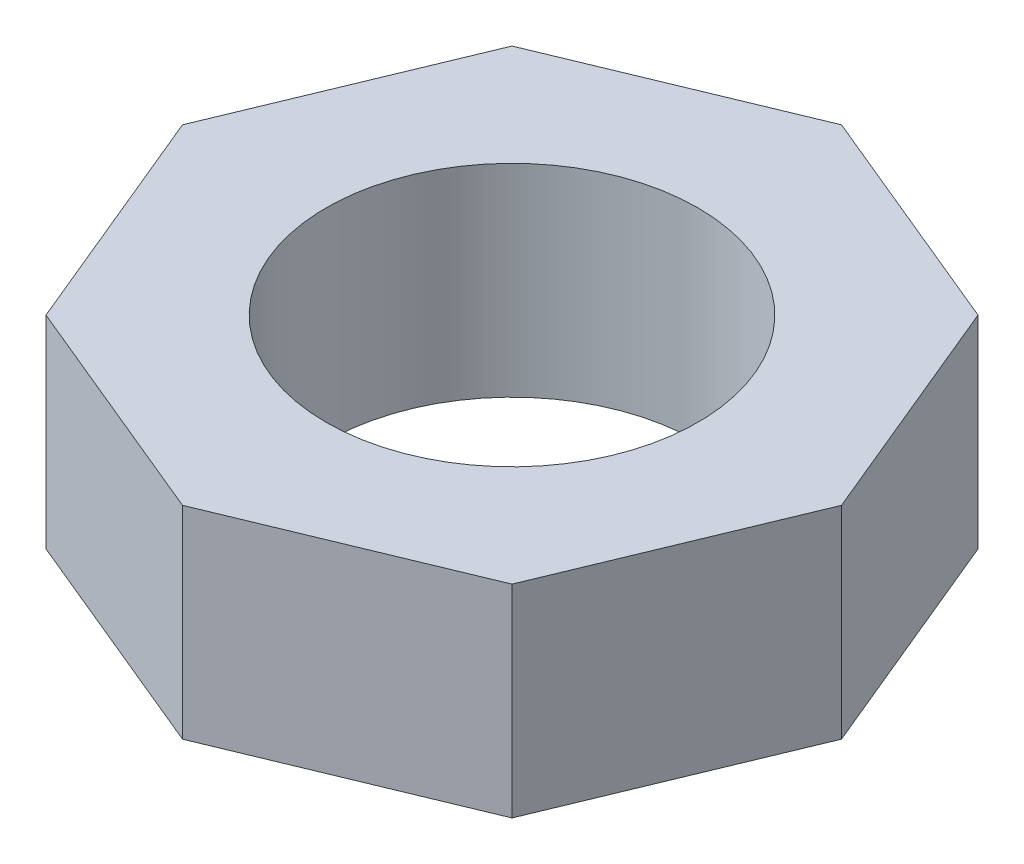
ISO-10303-21;
HEADER;
FILE_DESCRIPTION(('STEP AP214'),'2;1');
FILE_NAME('part.step','',(''),(''),'','','');
FILE_SCHEMA(('AUTOMOTIVE_DESIGN { 1 0 10303 214 1 1 1 1 }'));
ENDSEC;
DATA;
#1=APPLICATION_CONTEXT('core data for automotive mechanical design processes');
#2=APPLICATION_PROTOCOL_DEFINITION('international standard','automotive_design',2000,#1);
#3=PRODUCT_CONTEXT('',#1,'mechanical');
#4=PRODUCT('Part','Part','',(#3));
#5=PRODUCT_RELATED_PRODUCT_CATEGORY('part','',(#4));
#6=PRODUCT_DEFINITION_FORMATION('','',#4);
#7=PRODUCT_DEFINITION_CONTEXT('part definition',#1,'design');
#8=PRODUCT_DEFINITION('design','',#6,#7);
#9=PRODUCT_DEFINITION_SHAPE('','',#8);
#10=(LENGTH_UNIT() NAMED_UNIT(*) SI_UNIT(.MILLI.,.METRE.));
#11=(NAMED_UNIT(*) PLANE_ANGLE_UNIT() SI_UNIT($,.RADIAN.));
#12=(NAMED_UNIT(*) SI_UNIT($,.STERADIAN.) SOLID_ANGLE_UNIT());
#13=UNCERTAINTY_MEASURE_WITH_UNIT(LENGTH_MEASURE(1.E-05),#10,'distance_accuracy_value','');
#14=(GEOMETRIC_REPRESENTATION_CONTEXT(3) GLOBAL_UNCERTAINTY_ASSIGNED_CONTEXT((#13)) GLOBAL_UNIT_ASSIGNED_CONTEXT((#10,
#11,#12)) REPRESENTATION_CONTEXT('',''));
#15=CARTESIAN_POINT('',(0.,0.,0.));
#16=DIRECTION('',(0.,0.,1.));
#17=DIRECTION('',(1.,0.,0.));
#18=AXIS2_PLACEMENT_3D('',#15,#16,#17);
#19=CARTESIAN_POINT('',(0.,1.55,0.));
#20=DIRECTION('',(0.,1.,0.));
#21=DIRECTION('',(0.,0.,1.));
#22=AXIS2_PLACEMENT_3D('',#19,#20,#21);
#23=PLANE('',#22);
#24=DIRECTION('',(0.382683432365078,0.,-0.923879532511292));
#25=VECTOR('',#24,1.);
#26=CARTESIAN_POINT('',(1.78330479482134,1.55,1.7833047948213));
#27=LINE('',#26,#25);
#28=CARTESIAN_POINT('',(1.78330479482134,1.55,1.7833047948213));
#29=VERTEX_POINT('',#28);
#30=CARTESIAN_POINT('',(2.52197382668128,1.55,0.));
#31=VERTEX_POINT('',#30);
#32=EDGE_CURVE('E144',#29,#31,#27,.T.);
#33=ORIENTED_EDGE('',*,*,#32,.T.);
#34=DIRECTION('',(-0.382683432365102,0.,-0.923879532511282));
#35=VECTOR('',#34,1.);
#36=CARTESIAN_POINT('',(2.52197382668128,1.55,0.));
#37=LINE('',#36,#35);
#38=CARTESIAN_POINT('',(1.78330479482129,1.55,-1.78330479482134));
#39=VERTEX_POINT('',#38);
#40=EDGE_CURVE('E92',#31,#39,#37,.T.);
#41=ORIENTED_EDGE('',*,*,#40,.T.);
#42=DIRECTION('',(-0.923879532511292,0.,-0.382683432365078));
#43=VECTOR('',#42,1.);
#44=CARTESIAN_POINT('',(1.78330479482129,1.55,-1.78330479482134));
#45=LINE('',#44,#43);
#46=CARTESIAN_POINT('',(0.,1.55,-2.52197382668128));
#47=VERTEX_POINT('',#46);
#48=EDGE_CURVE('E159',#39,#47,#45,.T.);
#49=ORIENTED_EDGE('',*,*,#48,.T.);
#50=DIRECTION('',(-0.923879532511282,0.,0.382683432365102));
#51=VECTOR('',#50,1.);
#52=CARTESIAN_POINT('',(0.,1.55,-2.52197382668128));
#53=LINE('',#52,#51);
#54=CARTESIAN_POINT('',(-1.78330479482134,1.55,-1.7833047948213));
#55=VERTEX_POINT('',#54);
#56=EDGE_CURVE('E172',#47,#55,#53,.T.);
#57=ORIENTED_EDGE('',*,*,#56,.T.);
#58=DIRECTION('',(-0.382683432365078,0.,0.923879532511292));
#59=VECTOR('',#58,1.);
#60=CARTESIAN_POINT('',(-1.78330479482134,1.55,-1.7833047948213));
#61=LINE('',#60,#59);
#62=CARTESIAN_POINT('',(-2.52197382668128,1.55,0.));
#63=VERTEX_POINT('',#62);
#64=EDGE_CURVE('E111',#55,#63,#61,.T.);
#65=ORIENTED_EDGE('',*,*,#64,.T.);
#66=DIRECTION('',(0.382683432365101,0.,0.923879532511282));
#67=VECTOR('',#66,1.);
#68=CARTESIAN_POINT('',(-2.52197382668128,1.55,0.));
#69=LINE('',#68,#67);
#70=CARTESIAN_POINT('',(-1.7833047948213,1.55,1.78330479482134));
#71=VERTEX_POINT('',#70);
#72=EDGE_CURVE('E105',#63,#71,#69,.T.);
#73=ORIENTED_EDGE('',*,*,#72,.T.);
#74=DIRECTION('',(0.923879532511292,0.,0.382683432365078));
#75=VECTOR('',#74,1.);
#76=CARTESIAN_POINT('',(-1.7833047948213,1.55,1.78330479482134));
#77=LINE('',#76,#75);
#78=CARTESIAN_POINT('',(0.,1.55,2.52197382668128));
#79=VERTEX_POINT('',#78);
#80=EDGE_CURVE('E109',#71,#79,#77,.T.);
#81=ORIENTED_EDGE('',*,*,#80,.T.);
#82=DIRECTION('',(0.923879532511282,0.,-0.382683432365102));
#83=VECTOR('',#82,1.);
#84=CARTESIAN_POINT('',(0.,1.55,2.52197382668128));
#85=LINE('',#84,#83);
#86=EDGE_CURVE('E49',#79,#29,#85,.T.);
#87=ORIENTED_EDGE('',*,*,#86,.T.);
#88=EDGE_LOOP('',(#33,#41,#49,#57,#65,#73,#81,#87));
#89=FACE_BOUND('',#88,.T.);
#90=CARTESIAN_POINT('',(0.,1.55,0.));
#91=DIRECTION('',(0.,1.,0.));
#92=DIRECTION('',(0.,0.,1.));
#93=AXIS2_PLACEMENT_3D('',#90,#91,#92);
#94=CIRCLE('',#93,1.4225);
#95=CARTESIAN_POINT('',(0.,1.55,-1.4225));
#96=VERTEX_POINT('',#95);
#97=EDGE_CURVE('E133',#96,#96,#94,.T.);
#98=ORIENTED_EDGE('',*,*,#97,.F.);
#99=EDGE_LOOP('',(#98));
#100=FACE_BOUND('',#99,.T.);
#101=ADVANCED_FACE('F32',(#89,#100),#23,.T.);
#102=CARTESIAN_POINT('',(0.,0.,0.));
#103=DIRECTION('',(0.,1.,0.));
#104=DIRECTION('',(0.,0.,1.));
#105=AXIS2_PLACEMENT_3D('',#102,#103,#104);
#106=PLANE('',#105);
#107=DIRECTION('',(0.382683432365078,0.,-0.923879532511292));
#108=VECTOR('',#107,1.);
#109=CARTESIAN_POINT('',(1.78330479482134,0.,1.7833047948213));
#110=LINE('',#109,#108);
#111=CARTESIAN_POINT('',(1.78330479482134,0.,1.7833047948213));
#112=VERTEX_POINT('',#111);
#113=CARTESIAN_POINT('',(2.52197382668128,0.,0.));
#114=VERTEX_POINT('',#113);
#115=EDGE_CURVE('E129',#112,#114,#110,.T.);
#116=ORIENTED_EDGE('',*,*,#115,.F.);
#117=DIRECTION('',(0.923879532511282,0.,-0.382683432365102));
#118=VECTOR('',#117,1.);
#119=CARTESIAN_POINT('',(0.,0.,2.52197382668128));
#120=LINE('',#119,#118);
#121=CARTESIAN_POINT('',(0.,0.,2.52197382668128));
#122=VERTEX_POINT('',#121);
#123=EDGE_CURVE('E84',#122,#112,#120,.T.);
#124=ORIENTED_EDGE('',*,*,#123,.F.);
#125=DIRECTION('',(0.923879532511292,0.,0.382683432365078));
#126=VECTOR('',#125,1.);
#127=CARTESIAN_POINT('',(-1.7833047948213,0.,1.78330479482134));
#128=LINE('',#127,#126);
#129=CARTESIAN_POINT('',(-1.7833047948213,0.,1.78330479482134));
#130=VERTEX_POINT('',#129);
#131=EDGE_CURVE('E78',#130,#122,#128,.T.);
#132=ORIENTED_EDGE('',*,*,#131,.F.);
#133=DIRECTION('',(0.382683432365101,0.,0.923879532511282));
#134=VECTOR('',#133,1.);
#135=CARTESIAN_POINT('',(-2.52197382668128,0.,0.));
#136=LINE('',#135,#134);
#137=CARTESIAN_POINT('',(-2.52197382668128,0.,0.));
#138=VERTEX_POINT('',#137);
#139=EDGE_CURVE('E119',#138,#130,#136,.T.);
#140=ORIENTED_EDGE('',*,*,#139,.F.);
#141=DIRECTION('',(-0.382683432365078,0.,0.923879532511292));
#142=VECTOR('',#141,1.);
#143=CARTESIAN_POINT('',(-1.78330479482134,0.,-1.7833047948213));
#144=LINE('',#143,#142);
#145=CARTESIAN_POINT('',(-1.78330479482134,0.,-1.7833047948213));
#146=VERTEX_POINT('',#145);
#147=EDGE_CURVE('E139',#146,#138,#144,.T.);
#148=ORIENTED_EDGE('',*,*,#147,.F.);
#149=DIRECTION('',(-0.923879532511282,0.,0.382683432365102));
#150=VECTOR('',#149,1.);
#151=CARTESIAN_POINT('',(0.,0.,-2.52197382668128));
#152=LINE('',#151,#150);
#153=CARTESIAN_POINT('',(0.,0.,-2.52197382668128));
#154=VERTEX_POINT('',#153);
#155=EDGE_CURVE('E137',#154,#146,#152,.T.);
#156=ORIENTED_EDGE('',*,*,#155,.F.);
#157=DIRECTION('',(-0.923879532511292,0.,-0.382683432365078));
#158=VECTOR('',#157,1.);
#159=CARTESIAN_POINT('',(1.78330479482129,0.,-1.78330479482134));
#160=LINE('',#159,#158);
#161=CARTESIAN_POINT('',(1.78330479482129,0.,-1.78330479482134));
#162=VERTEX_POINT('',#161);
#163=EDGE_CURVE('E135',#162,#154,#160,.T.);
#164=ORIENTED_EDGE('',*,*,#163,.F.);
#165=DIRECTION('',(-0.382683432365102,0.,-0.923879532511282));
#166=VECTOR('',#165,1.);
#167=CARTESIAN_POINT('',(2.52197382668128,0.,0.));
#168=LINE('',#167,#166);
#169=EDGE_CURVE('E132',#114,#162,#168,.T.);
#170=ORIENTED_EDGE('',*,*,#169,.F.);
#171=EDGE_LOOP('',(#116,#124,#132,#140,#148,#156,#164,#170));
#172=FACE_BOUND('',#171,.T.);
#173=CARTESIAN_POINT('',(0.,0.,0.));
#174=DIRECTION('',(0.,1.,0.));
#175=DIRECTION('',(0.,0.,1.));
#176=AXIS2_PLACEMENT_3D('',#173,#174,#175);
#177=CIRCLE('',#176,1.4225);
#178=CARTESIAN_POINT('',(0.,0.,-1.4225));
#179=VERTEX_POINT('',#178);
#180=EDGE_CURVE('E178',#179,#179,#177,.T.);
#181=ORIENTED_EDGE('',*,*,#180,.T.);
#182=EDGE_LOOP('',(#181));
#183=FACE_BOUND('',#182,.T.);
#184=ADVANCED_FACE('F163',(#172,#183),#106,.F.);
#185=CARTESIAN_POINT('',(1.78330479482134,1.55,1.7833047948213));
#186=DIRECTION('',(-0.923879532511292,0.,-0.382683432365078));
#187=DIRECTION('',(-0.382683432365078,0.,0.923879532511292));
#188=AXIS2_PLACEMENT_3D('',#185,#186,#187);
#189=PLANE('',#188);
#190=ORIENTED_EDGE('',*,*,#115,.T.);
#191=DIRECTION('',(0.,-1.,0.));
#192=VECTOR('',#191,1.);
#193=CARTESIAN_POINT('',(2.52197382668128,1.55,0.));
#194=LINE('',#193,#192);
#195=EDGE_CURVE('E11',#31,#114,#194,.T.);
#196=ORIENTED_EDGE('',*,*,#195,.F.);
#197=ORIENTED_EDGE('',*,*,#32,.F.);
#198=DIRECTION('',(0.,-1.,0.));
#199=VECTOR('',#198,1.);
#200=CARTESIAN_POINT('',(1.78330479482134,1.55,1.7833047948213));
#201=LINE('',#200,#199);
#202=EDGE_CURVE('E125',#29,#112,#201,.T.);
#203=ORIENTED_EDGE('',*,*,#202,.T.);
#204=EDGE_LOOP('',(#190,#196,#197,#203));
#205=FACE_BOUND('',#204,.T.);
#206=ADVANCED_FACE('F34',(#205),#189,.F.);
#207=CARTESIAN_POINT('',(2.52197382668128,1.55,0.));
#208=DIRECTION('',(-0.923879532511282,0.,0.382683432365102));
#209=DIRECTION('',(0.382683432365102,0.,0.923879532511282));
#210=AXIS2_PLACEMENT_3D('',#207,#208,#209);
#211=PLANE('',#210);
#212=ORIENTED_EDGE('',*,*,#169,.T.);
#213=DIRECTION('',(0.,-1.,0.));
#214=VECTOR('',#213,1.);
#215=CARTESIAN_POINT('',(1.78330479482129,1.55,-1.78330479482134));
#216=LINE('',#215,#214);
#217=EDGE_CURVE('E41',#39,#162,#216,.T.);
#218=ORIENTED_EDGE('',*,*,#217,.F.);
#219=ORIENTED_EDGE('',*,*,#40,.F.);
#220=ORIENTED_EDGE('',*,*,#195,.T.);
#221=EDGE_LOOP('',(#212,#218,#219,#220));
#222=FACE_BOUND('',#221,.T.);
#223=ADVANCED_FACE('F206',(#222),#211,.F.);
#224=CARTESIAN_POINT('',(1.78330479482129,1.55,-1.78330479482134));
#225=DIRECTION('',(-0.382683432365078,0.,0.923879532511292));
#226=DIRECTION('',(0.923879532511292,0.,0.382683432365078));
#227=AXIS2_PLACEMENT_3D('',#224,#225,#226);
#228=PLANE('',#227);
#229=ORIENTED_EDGE('',*,*,#163,.T.);
#230=DIRECTION('',(0.,-1.,0.));
#231=VECTOR('',#230,1.);
#232=CARTESIAN_POINT('',(0.,1.55,-2.52197382668128));
#233=LINE('',#232,#231);
#234=EDGE_CURVE('E151',#47,#154,#233,.T.);
#235=ORIENTED_EDGE('',*,*,#234,.F.);
#236=ORIENTED_EDGE('',*,*,#48,.F.);
#237=ORIENTED_EDGE('',*,*,#217,.T.);
#238=EDGE_LOOP('',(#229,#235,#236,#237));
#239=FACE_BOUND('',#238,.T.);
#240=ADVANCED_FACE('F157',(#239),#228,.F.);
#241=CARTESIAN_POINT('',(0.,1.55,-2.52197382668128));
#242=DIRECTION('',(0.382683432365102,0.,0.923879532511282));
#243=DIRECTION('',(0.923879532511282,0.,-0.382683432365102));
#244=AXIS2_PLACEMENT_3D('',#241,#242,#243);
#245=PLANE('',#244);
#246=ORIENTED_EDGE('',*,*,#155,.T.);
#247=DIRECTION('',(0.,-1.,0.));
#248=VECTOR('',#247,1.);
#249=CARTESIAN_POINT('',(-1.78330479482134,1.55,-1.7833047948213));
#250=LINE('',#249,#248);
#251=EDGE_CURVE('E148',#55,#146,#250,.T.);
#252=ORIENTED_EDGE('',*,*,#251,.F.);
#253=ORIENTED_EDGE('',*,*,#56,.F.);
#254=ORIENTED_EDGE('',*,*,#234,.T.);
#255=EDGE_LOOP('',(#246,#252,#253,#254));
#256=FACE_BOUND('',#255,.T.);
#257=ADVANCED_FACE('F168',(#256),#245,.F.);
#258=CARTESIAN_POINT('',(-1.78330479482134,1.55,-1.7833047948213));
#259=DIRECTION('',(0.923879532511292,0.,0.382683432365078));
#260=DIRECTION('',(0.382683432365078,0.,-0.923879532511292));
#261=AXIS2_PLACEMENT_3D('',#258,#259,#260);
#262=PLANE('',#261);
#263=ORIENTED_EDGE('',*,*,#147,.T.);
#264=DIRECTION('',(0.,-1.,0.));
#265=VECTOR('',#264,1.);
#266=CARTESIAN_POINT('',(-2.52197382668128,1.55,0.));
#267=LINE('',#266,#265);
#268=EDGE_CURVE('E120',#63,#138,#267,.T.);
#269=ORIENTED_EDGE('',*,*,#268,.F.);
#270=ORIENTED_EDGE('',*,*,#64,.F.);
#271=ORIENTED_EDGE('',*,*,#251,.T.);
#272=EDGE_LOOP('',(#263,#269,#270,#271));
#273=FACE_BOUND('',#272,.T.);
#274=ADVANCED_FACE('F171',(#273),#262,.F.);
#275=CARTESIAN_POINT('',(-2.52197382668128,1.55,0.));
#276=DIRECTION('',(0.923879532511282,0.,-0.382683432365101));
#277=DIRECTION('',(-0.382683432365102,0.,-0.923879532511282));
#278=AXIS2_PLACEMENT_3D('',#275,#276,#277);
#279=PLANE('',#278);
#280=ORIENTED_EDGE('',*,*,#139,.T.);
#281=DIRECTION('',(0.,-1.,0.));
#282=VECTOR('',#281,1.);
#283=CARTESIAN_POINT('',(-1.7833047948213,1.55,1.78330479482134));
#284=LINE('',#283,#282);
#285=EDGE_CURVE('E116',#71,#130,#284,.T.);
#286=ORIENTED_EDGE('',*,*,#285,.F.);
#287=ORIENTED_EDGE('',*,*,#72,.F.);
#288=ORIENTED_EDGE('',*,*,#268,.T.);
#289=EDGE_LOOP('',(#280,#286,#287,#288));
#290=FACE_BOUND('',#289,.T.);
#291=ADVANCED_FACE('F117',(#290),#279,.F.);
#292=CARTESIAN_POINT('',(-1.7833047948213,1.55,1.78330479482134));
#293=DIRECTION('',(0.382683432365078,0.,-0.923879532511292));
#294=DIRECTION('',(-0.923879532511292,0.,-0.382683432365078));
#295=AXIS2_PLACEMENT_3D('',#292,#293,#294);
#296=PLANE('',#295);
#297=ORIENTED_EDGE('',*,*,#131,.T.);
#298=DIRECTION('',(0.,-1.,0.));
#299=VECTOR('',#298,1.);
#300=CARTESIAN_POINT('',(0.,1.55,2.52197382668128));
#301=LINE('',#300,#299);
#302=EDGE_CURVE('E121',#79,#122,#301,.T.);
#303=ORIENTED_EDGE('',*,*,#302,.F.);
#304=ORIENTED_EDGE('',*,*,#80,.F.);
#305=ORIENTED_EDGE('',*,*,#285,.T.);
#306=EDGE_LOOP('',(#297,#303,#304,#305));
#307=FACE_BOUND('',#306,.T.);
#308=ADVANCED_FACE('F123',(#307),#296,.F.);
#309=CARTESIAN_POINT('',(0.,1.55,2.52197382668128));
#310=DIRECTION('',(-0.382683432365102,0.,-0.923879532511282));
#311=DIRECTION('',(-0.923879532511282,0.,0.382683432365102));
#312=AXIS2_PLACEMENT_3D('',#309,#310,#311);
#313=PLANE('',#312);
#314=ORIENTED_EDGE('',*,*,#123,.T.);
#315=ORIENTED_EDGE('',*,*,#202,.F.);
#316=ORIENTED_EDGE('',*,*,#86,.F.);
#317=ORIENTED_EDGE('',*,*,#302,.T.);
#318=EDGE_LOOP('',(#314,#315,#316,#317));
#319=FACE_BOUND('',#318,.T.);
#320=ADVANCED_FACE('F194',(#319),#313,.F.);
#321=CARTESIAN_POINT('',(0.,1.55,0.));
#322=DIRECTION('',(0.,-1.,0.));
#323=DIRECTION('',(0.,0.,-1.));
#324=AXIS2_PLACEMENT_3D('',#321,#322,#323);
#325=CYLINDRICAL_SURFACE('',#324,1.4225);
#326=CARTESIAN_POINT('',(0.,1.55,-1.4225));
#327=CARTESIAN_POINT('',(0.,1.53385416666667,-1.4225));
#328=CARTESIAN_POINT('',(0.,1.51770833333333,-1.4225));
#329=CARTESIAN_POINT('',(0.,1.48541666666667,-1.4225));
#330=CARTESIAN_POINT('',(0.,1.46927083333333,-1.4225));
#331=CARTESIAN_POINT('',(0.,1.43697916666667,-1.4225));
#332=CARTESIAN_POINT('',(0.,1.42083333333333,-1.4225));
#333=CARTESIAN_POINT('',(0.,1.38854166666667,-1.4225));
#334=CARTESIAN_POINT('',(0.,1.37239583333333,-1.4225));
#335=CARTESIAN_POINT('',(0.,1.34010416666667,-1.4225));
#336=CARTESIAN_POINT('',(0.,1.32395833333333,-1.4225));
#337=CARTESIAN_POINT('',(0.,1.29166666666667,-1.4225));
#338=CARTESIAN_POINT('',(0.,1.27552083333333,-1.4225));
#339=CARTESIAN_POINT('',(0.,1.24322916666667,-1.4225));
#340=CARTESIAN_POINT('',(0.,1.22708333333333,-1.4225));
#341=CARTESIAN_POINT('',(0.,1.19479166666667,-1.4225));
#342=CARTESIAN_POINT('',(0.,1.17864583333333,-1.4225));
#343=CARTESIAN_POINT('',(0.,1.14635416666667,-1.4225));
#344=CARTESIAN_POINT('',(0.,1.13020833333333,-1.4225));
#345=CARTESIAN_POINT('',(0.,1.09791666666667,-1.4225));
#346=CARTESIAN_POINT('',(0.,1.08177083333333,-1.4225));
#347=CARTESIAN_POINT('',(0.,1.04947916666667,-1.4225));
#348=CARTESIAN_POINT('',(0.,1.03333333333333,-1.4225));
#349=CARTESIAN_POINT('',(0.,1.00104166666667,-1.4225));
#350=CARTESIAN_POINT('',(0.,0.984895833333333,-1.4225));
#351=CARTESIAN_POINT('',(0.,0.952604166666667,-1.4225));
#352=CARTESIAN_POINT('',(0.,0.936458333333333,-1.4225));
#353=CARTESIAN_POINT('',(0.,0.904166666666667,-1.4225));
#354=CARTESIAN_POINT('',(0.,0.888020833333333,-1.4225));
#355=CARTESIAN_POINT('',(0.,0.855729166666667,-1.4225));
#356=CARTESIAN_POINT('',(0.,0.839583333333333,-1.4225));
#357=CARTESIAN_POINT('',(0.,0.807291666666667,-1.4225));
#358=CARTESIAN_POINT('',(0.,0.791145833333333,-1.4225));
#359=CARTESIAN_POINT('',(0.,0.758854166666667,-1.4225));
#360=CARTESIAN_POINT('',(0.,0.742708333333333,-1.4225));
#361=CARTESIAN_POINT('',(0.,0.710416666666667,-1.4225));
#362=CARTESIAN_POINT('',(0.,0.694270833333333,-1.4225));
#363=CARTESIAN_POINT('',(0.,0.661979166666667,-1.4225));
#364=CARTESIAN_POINT('',(0.,0.645833333333333,-1.4225));
#365=CARTESIAN_POINT('',(0.,0.613541666666667,-1.4225));
#366=CARTESIAN_POINT('',(0.,0.597395833333333,-1.4225));
#367=CARTESIAN_POINT('',(0.,0.565104166666667,-1.4225));
#368=CARTESIAN_POINT('',(0.,0.548958333333333,-1.4225));
#369=CARTESIAN_POINT('',(0.,0.516666666666667,-1.4225));
#370=CARTESIAN_POINT('',(0.,0.500520833333333,-1.4225));
#371=CARTESIAN_POINT('',(0.,0.468229166666667,-1.4225));
#372=CARTESIAN_POINT('',(0.,0.452083333333333,-1.4225));
#373=CARTESIAN_POINT('',(0.,0.419791666666667,-1.4225));
#374=CARTESIAN_POINT('',(0.,0.403645833333333,-1.4225));
#375=CARTESIAN_POINT('',(0.,0.371354166666667,-1.4225));
#376=CARTESIAN_POINT('',(0.,0.355208333333333,-1.4225));
#377=CARTESIAN_POINT('',(0.,0.322916666666667,-1.4225));
#378=CARTESIAN_POINT('',(0.,0.306770833333333,-1.4225));
#379=CARTESIAN_POINT('',(0.,0.274479166666667,-1.4225));
#380=CARTESIAN_POINT('',(0.,0.258333333333333,-1.4225));
#381=CARTESIAN_POINT('',(0.,0.226041666666667,-1.4225));
#382=CARTESIAN_POINT('',(0.,0.209895833333333,-1.4225));
#383=CARTESIAN_POINT('',(0.,0.177604166666667,-1.4225));
#384=CARTESIAN_POINT('',(0.,0.161458333333333,-1.4225));
#385=CARTESIAN_POINT('',(0.,0.129166666666667,-1.4225));
#386=CARTESIAN_POINT('',(0.,0.113020833333333,-1.4225));
#387=CARTESIAN_POINT('',(0.,0.0807291666666667,-1.4225));
#388=CARTESIAN_POINT('',(0.,0.0645833333333334,-1.4225));
#389=CARTESIAN_POINT('',(0.,0.0322916666666667,-1.4225));
#390=CARTESIAN_POINT('',(0.,0.0161458333333334,-1.4225));
#391=CARTESIAN_POINT('',(0.,0.,-1.4225));
#392=B_SPLINE_CURVE_WITH_KNOTS('',3,(#326,#327,#328,#329,#330,#331,#332,#333,#334,#335,#336,
#337,#338,#339,#340,#341,#342,#343,#344,#345,#346,#347,#348,#349,#350,#351,#352,#353,#354,#355,
#356,#357,#358,#359,#360,#361,#362,#363,#364,#365,#366,#367,#368,#369,#370,#371,#372,#373,#374,
#375,#376,#377,#378,#379,#380,#381,#382,#383,#384,#385,#386,#387,#388,#389,#390,#391),
.UNSPECIFIED.,.F.,.F.,(4,2,2,2,2,2,2,2,2,2,2,2,2,2,2,2,2,2,2,2,2,2,2,2,2,2,2,2,2,2,2,2,4),(0.,
0.0484375000000001,0.0968750000000002,0.1453125,0.19375,0.2421875,0.290625,0.3390625,0.3875,
0.4359375,0.484375,0.5328125,0.58125,0.6296875,0.678125,0.7265625,0.775,0.8234375,0.871875,
0.9203125,0.96875,1.0171875,1.065625,1.1140625,1.1625,1.2109375,1.259375,1.3078125,1.35625,
1.4046875,1.453125,1.5015625,1.55),.UNSPECIFIED.);
#393=EDGE_CURVE('BSEAM184',#96,#179,#392,.T.);
#394=ORIENTED_EDGE('',*,*,#97,.T.);
#395=ORIENTED_EDGE('',*,*,#180,.F.);
#396=ORIENTED_EDGE('',*,*,#393,.T.);
#397=ORIENTED_EDGE('',*,*,#393,.F.);
#398=EDGE_LOOP('',(#394,#396,#395,#397));
#399=FACE_BOUND('',#398,.T.);
#400=ADVANCED_FACE('F184',(#399),#325,.F.);
#401=CLOSED_SHELL('',(#101,#184,#206,#223,#240,#257,#274,#291,#308,#320,#400));
#402=MANIFOLD_SOLID_BREP('B2',#401);
#403=ADVANCED_BREP_SHAPE_REPRESENTATION('',(#18,#402),#14);
#404=SHAPE_DEFINITION_REPRESENTATION(#9,#403);
ENDSEC;
END-ISO-10303-21;
